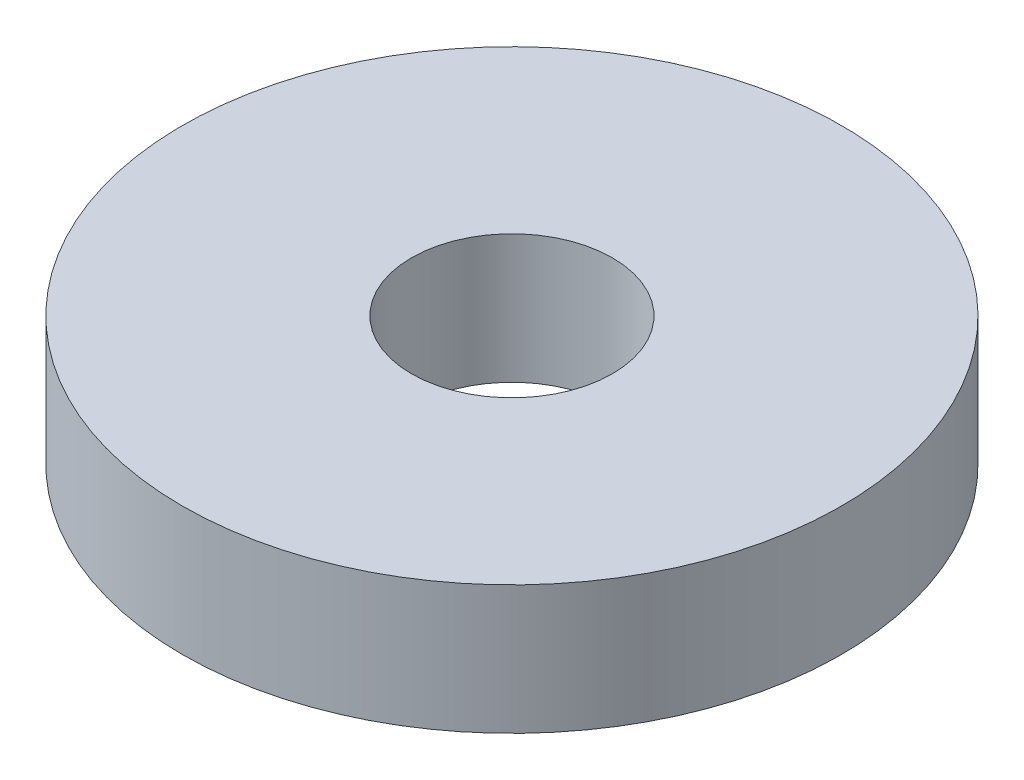
ISO-10303-21;
HEADER;
FILE_DESCRIPTION(('STEP AP214'),'2;1');
FILE_NAME('part.step','',(''),(''),'','','');
FILE_SCHEMA(('AUTOMOTIVE_DESIGN { 1 0 10303 214 1 1 1 1 }'));
ENDSEC;
DATA;
#1=APPLICATION_CONTEXT('core data for automotive mechanical design processes');
#2=APPLICATION_PROTOCOL_DEFINITION('international standard','automotive_design',2000,#1);
#3=PRODUCT_CONTEXT('',#1,'mechanical');
#4=PRODUCT('Part','Part','',(#3));
#5=PRODUCT_RELATED_PRODUCT_CATEGORY('part','',(#4));
#6=PRODUCT_DEFINITION_FORMATION('','',#4);
#7=PRODUCT_DEFINITION_CONTEXT('part definition',#1,'design');
#8=PRODUCT_DEFINITION('design','',#6,#7);
#9=PRODUCT_DEFINITION_SHAPE('','',#8);
#10=(LENGTH_UNIT() NAMED_UNIT(*) SI_UNIT(.MILLI.,.METRE.));
#11=(NAMED_UNIT(*) PLANE_ANGLE_UNIT() SI_UNIT($,.RADIAN.));
#12=(NAMED_UNIT(*) SI_UNIT($,.STERADIAN.) SOLID_ANGLE_UNIT());
#13=UNCERTAINTY_MEASURE_WITH_UNIT(LENGTH_MEASURE(1.E-05),#10,'distance_accuracy_value','');
#14=(GEOMETRIC_REPRESENTATION_CONTEXT(3) GLOBAL_UNCERTAINTY_ASSIGNED_CONTEXT((#13)) GLOBAL_UNIT_ASSIGNED_CONTEXT((#10,
#11,#12)) REPRESENTATION_CONTEXT('',''));
#15=CARTESIAN_POINT('',(0.,0.,0.));
#16=DIRECTION('',(0.,0.,1.));
#17=DIRECTION('',(1.,0.,0.));
#18=AXIS2_PLACEMENT_3D('',#15,#16,#17);
#19=CARTESIAN_POINT('',(0.,0.8,0.));
#20=DIRECTION('',(0.,1.,0.));
#21=DIRECTION('',(0.,0.,1.));
#22=AXIS2_PLACEMENT_3D('',#19,#20,#21);
#23=PLANE('',#22);
#24=CARTESIAN_POINT('',(0.,0.8,0.));
#25=DIRECTION('',(0.,1.,0.));
#26=DIRECTION('',(0.,0.,1.));
#27=AXIS2_PLACEMENT_3D('',#24,#25,#26);
#28=CIRCLE('',#27,2.05);
#29=CARTESIAN_POINT('',(0.,0.8,2.05));
#30=VERTEX_POINT('',#29);
#31=EDGE_CURVE('E10',#30,#30,#28,.T.);
#32=ORIENTED_EDGE('',*,*,#31,.T.);
#33=EDGE_LOOP('',(#32));
#34=FACE_BOUND('',#33,.T.);
#35=CARTESIAN_POINT('',(0.,0.8,0.));
#36=DIRECTION('',(0.,1.,0.));
#37=DIRECTION('',(0.,0.,1.));
#38=AXIS2_PLACEMENT_3D('',#35,#36,#37);
#39=CIRCLE('',#38,0.625);
#40=CARTESIAN_POINT('',(0.,0.8,0.625));
#41=VERTEX_POINT('',#40);
#42=EDGE_CURVE('E43',#41,#41,#39,.T.);
#43=ORIENTED_EDGE('',*,*,#42,.F.);
#44=EDGE_LOOP('',(#43));
#45=FACE_BOUND('',#44,.T.);
#46=ADVANCED_FACE('F32',(#34,#45),#23,.T.);
#47=CARTESIAN_POINT('',(0.,0.,0.));
#48=DIRECTION('',(0.,1.,0.));
#49=DIRECTION('',(0.,0.,1.));
#50=AXIS2_PLACEMENT_3D('',#47,#48,#49);
#51=PLANE('',#50);
#52=CARTESIAN_POINT('',(0.,0.,0.));
#53=DIRECTION('',(0.,1.,0.));
#54=DIRECTION('',(0.,0.,1.));
#55=AXIS2_PLACEMENT_3D('',#52,#53,#54);
#56=CIRCLE('',#55,2.05);
#57=CARTESIAN_POINT('',(0.,0.,2.05));
#58=VERTEX_POINT('',#57);
#59=EDGE_CURVE('E36',#58,#58,#56,.T.);
#60=ORIENTED_EDGE('',*,*,#59,.F.);
#61=EDGE_LOOP('',(#60));
#62=FACE_BOUND('',#61,.T.);
#63=CARTESIAN_POINT('',(0.,0.,0.));
#64=DIRECTION('',(0.,1.,0.));
#65=DIRECTION('',(0.,0.,1.));
#66=AXIS2_PLACEMENT_3D('',#63,#64,#65);
#67=CIRCLE('',#66,0.625);
#68=CARTESIAN_POINT('',(0.,0.,0.625));
#69=VERTEX_POINT('',#68);
#70=EDGE_CURVE('E45',#69,#69,#67,.T.);
#71=ORIENTED_EDGE('',*,*,#70,.T.);
#72=EDGE_LOOP('',(#71));
#73=FACE_BOUND('',#72,.T.);
#74=ADVANCED_FACE('F55',(#62,#73),#51,.F.);
#75=CARTESIAN_POINT('',(0.,0.8,0.));
#76=DIRECTION('',(0.,-1.,0.));
#77=DIRECTION('',(0.,0.,-1.));
#78=AXIS2_PLACEMENT_3D('',#75,#76,#77);
#79=CYLINDRICAL_SURFACE('',#78,2.05);
#80=ORIENTED_EDGE('',*,*,#31,.F.);
#81=EDGE_LOOP('',(#80));
#82=FACE_BOUND('',#81,.T.);
#83=ORIENTED_EDGE('',*,*,#59,.T.);
#84=EDGE_LOOP('',(#83));
#85=FACE_BOUND('',#84,.T.);
#86=ADVANCED_FACE('F34',(#82,#85),#79,.T.);
#87=CARTESIAN_POINT('',(0.,0.8,0.));
#88=DIRECTION('',(0.,-1.,0.));
#89=DIRECTION('',(0.,0.,-1.));
#90=AXIS2_PLACEMENT_3D('',#87,#88,#89);
#91=CYLINDRICAL_SURFACE('',#90,0.625);
#92=ORIENTED_EDGE('',*,*,#42,.T.);
#93=EDGE_LOOP('',(#92));
#94=FACE_BOUND('',#93,.T.);
#95=ORIENTED_EDGE('',*,*,#70,.F.);
#96=EDGE_LOOP('',(#95));
#97=FACE_BOUND('',#96,.T.);
#98=ADVANCED_FACE('F51',(#94,#97),#91,.F.);
#99=CLOSED_SHELL('',(#46,#74,#86,#98));
#100=MANIFOLD_SOLID_BREP('B2',#99);
#101=ADVANCED_BREP_SHAPE_REPRESENTATION('',(#18,#100),#14);
#102=SHAPE_DEFINITION_REPRESENTATION(#9,#101);
ENDSEC;
END-ISO-10303-21;
